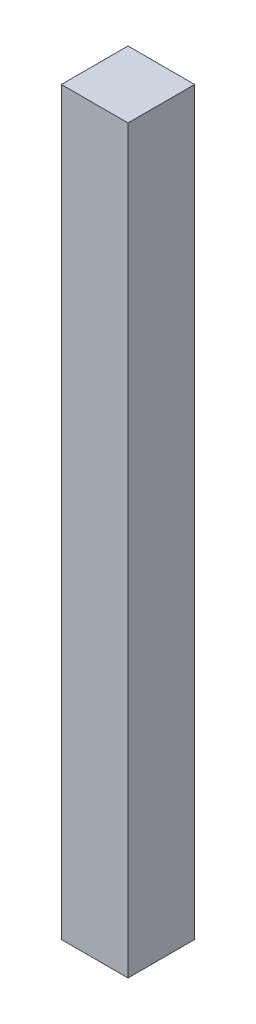
ISO-10303-21;
HEADER;
FILE_DESCRIPTION(('STEP AP214'),'2;1');
FILE_NAME('part.step','',(''),(''),'','','');
FILE_SCHEMA(('AUTOMOTIVE_DESIGN { 1 0 10303 214 1 1 1 1 }'));
ENDSEC;
DATA;
#1=APPLICATION_CONTEXT('core data for automotive mechanical design processes');
#2=APPLICATION_PROTOCOL_DEFINITION('international standard','automotive_design',2000,#1);
#3=PRODUCT_CONTEXT('',#1,'mechanical');
#4=PRODUCT('Part','Part','',(#3));
#5=PRODUCT_RELATED_PRODUCT_CATEGORY('part','',(#4));
#6=PRODUCT_DEFINITION_FORMATION('','',#4);
#7=PRODUCT_DEFINITION_CONTEXT('part definition',#1,'design');
#8=PRODUCT_DEFINITION('design','',#6,#7);
#9=PRODUCT_DEFINITION_SHAPE('','',#8);
#10=(LENGTH_UNIT() NAMED_UNIT(*) SI_UNIT(.MILLI.,.METRE.));
#11=(NAMED_UNIT(*) PLANE_ANGLE_UNIT() SI_UNIT($,.RADIAN.));
#12=(NAMED_UNIT(*) SI_UNIT($,.STERADIAN.) SOLID_ANGLE_UNIT());
#13=UNCERTAINTY_MEASURE_WITH_UNIT(LENGTH_MEASURE(1.E-05),#10,'distance_accuracy_value','');
#14=(GEOMETRIC_REPRESENTATION_CONTEXT(3) GLOBAL_UNCERTAINTY_ASSIGNED_CONTEXT((#13)) GLOBAL_UNIT_ASSIGNED_CONTEXT((#10,
#11,#12)) REPRESENTATION_CONTEXT('',''));
#15=CARTESIAN_POINT('',(0.,0.,0.));
#16=DIRECTION('',(0.,0.,1.));
#17=DIRECTION('',(1.,0.,0.));
#18=AXIS2_PLACEMENT_3D('',#15,#16,#17);
#19=CARTESIAN_POINT('',(654.,436.,-30.));
#20=DIRECTION('',(-1.,0.,0.));
#21=DIRECTION('',(0.,0.,1.));
#22=AXIS2_PLACEMENT_3D('',#19,#20,#21);
#23=PLANE('',#22);
#24=DIRECTION('',(0.,-1.,0.));
#25=VECTOR('',#24,1.);
#26=CARTESIAN_POINT('',(654.,436.,-12.));
#27=LINE('',#26,#25);
#28=CARTESIAN_POINT('',(654.,636.,-12.));
#29=VERTEX_POINT('',#28);
#30=CARTESIAN_POINT('',(654.,436.,-12.));
#31=VERTEX_POINT('',#30);
#32=EDGE_CURVE('E103',#29,#31,#27,.T.);
#33=ORIENTED_EDGE('',*,*,#32,.F.);
#34=DIRECTION('',(0.,0.,1.));
#35=VECTOR('',#34,1.);
#36=CARTESIAN_POINT('',(654.,636.,-30.));
#37=LINE('',#36,#35);
#38=CARTESIAN_POINT('',(654.,636.,-30.));
#39=VERTEX_POINT('',#38);
#40=EDGE_CURVE('E11',#39,#29,#37,.T.);
#41=ORIENTED_EDGE('',*,*,#40,.F.);
#42=DIRECTION('',(0.,-1.,0.));
#43=VECTOR('',#42,1.);
#44=CARTESIAN_POINT('',(654.,436.,-30.));
#45=LINE('',#44,#43);
#46=CARTESIAN_POINT('',(654.,436.,-30.));
#47=VERTEX_POINT('',#46);
#48=EDGE_CURVE('E97',#39,#47,#45,.T.);
#49=ORIENTED_EDGE('',*,*,#48,.T.);
#50=DIRECTION('',(0.,0.,1.));
#51=VECTOR('',#50,1.);
#52=CARTESIAN_POINT('',(654.,436.,-30.));
#53=LINE('',#52,#51);
#54=EDGE_CURVE('E42',#47,#31,#53,.T.);
#55=ORIENTED_EDGE('',*,*,#54,.T.);
#56=EDGE_LOOP('',(#33,#41,#49,#55));
#57=FACE_BOUND('',#56,.T.);
#58=ADVANCED_FACE('F39',(#57),#23,.T.);
#59=CARTESIAN_POINT('',(654.,636.,-30.));
#60=DIRECTION('',(0.,1.,0.));
#61=DIRECTION('',(0.,0.,1.));
#62=AXIS2_PLACEMENT_3D('',#59,#60,#61);
#63=PLANE('',#62);
#64=DIRECTION('',(-1.,0.,0.));
#65=VECTOR('',#64,1.);
#66=CARTESIAN_POINT('',(654.,636.,-12.));
#67=LINE('',#66,#65);
#68=CARTESIAN_POINT('',(672.,636.,-12.));
#69=VERTEX_POINT('',#68);
#70=EDGE_CURVE('E99',#69,#29,#67,.T.);
#71=ORIENTED_EDGE('',*,*,#70,.F.);
#72=DIRECTION('',(0.,0.,1.));
#73=VECTOR('',#72,1.);
#74=CARTESIAN_POINT('',(672.,636.,-30.));
#75=LINE('',#74,#73);
#76=CARTESIAN_POINT('',(672.,636.,-30.));
#77=VERTEX_POINT('',#76);
#78=EDGE_CURVE('E48',#77,#69,#75,.T.);
#79=ORIENTED_EDGE('',*,*,#78,.F.);
#80=DIRECTION('',(-1.,0.,0.));
#81=VECTOR('',#80,1.);
#82=CARTESIAN_POINT('',(654.,636.,-30.));
#83=LINE('',#82,#81);
#84=EDGE_CURVE('E94',#77,#39,#83,.T.);
#85=ORIENTED_EDGE('',*,*,#84,.T.);
#86=ORIENTED_EDGE('',*,*,#40,.T.);
#87=EDGE_LOOP('',(#71,#79,#85,#86));
#88=FACE_BOUND('',#87,.T.);
#89=ADVANCED_FACE('F113',(#88),#63,.T.);
#90=CARTESIAN_POINT('',(672.,436.,-30.));
#91=DIRECTION('',(1.,0.,0.));
#92=DIRECTION('',(0.,0.,-1.));
#93=AXIS2_PLACEMENT_3D('',#90,#91,#92);
#94=PLANE('',#93);
#95=DIRECTION('',(0.,1.,0.));
#96=VECTOR('',#95,1.);
#97=CARTESIAN_POINT('',(672.,436.,-12.));
#98=LINE('',#97,#96);
#99=CARTESIAN_POINT('',(672.,436.,-12.));
#100=VERTEX_POINT('',#99);
#101=EDGE_CURVE('E89',#100,#69,#98,.T.);
#102=ORIENTED_EDGE('',*,*,#101,.F.);
#103=DIRECTION('',(0.,0.,1.));
#104=VECTOR('',#103,1.);
#105=CARTESIAN_POINT('',(672.,436.,-30.));
#106=LINE('',#105,#104);
#107=CARTESIAN_POINT('',(672.,436.,-30.));
#108=VERTEX_POINT('',#107);
#109=EDGE_CURVE('E84',#108,#100,#106,.T.);
#110=ORIENTED_EDGE('',*,*,#109,.F.);
#111=DIRECTION('',(0.,1.,0.));
#112=VECTOR('',#111,1.);
#113=CARTESIAN_POINT('',(672.,436.,-30.));
#114=LINE('',#113,#112);
#115=EDGE_CURVE('E87',#108,#77,#114,.T.);
#116=ORIENTED_EDGE('',*,*,#115,.T.);
#117=ORIENTED_EDGE('',*,*,#78,.T.);
#118=EDGE_LOOP('',(#102,#110,#116,#117));
#119=FACE_BOUND('',#118,.T.);
#120=ADVANCED_FACE('F86',(#119),#94,.T.);
#121=CARTESIAN_POINT('',(654.,436.,-30.));
#122=DIRECTION('',(0.,-1.,0.));
#123=DIRECTION('',(0.,0.,-1.));
#124=AXIS2_PLACEMENT_3D('',#121,#122,#123);
#125=PLANE('',#124);
#126=DIRECTION('',(1.,0.,0.));
#127=VECTOR('',#126,1.);
#128=CARTESIAN_POINT('',(654.,436.,-12.));
#129=LINE('',#128,#127);
#130=EDGE_CURVE('E106',#31,#100,#129,.T.);
#131=ORIENTED_EDGE('',*,*,#130,.F.);
#132=ORIENTED_EDGE('',*,*,#54,.F.);
#133=DIRECTION('',(1.,0.,0.));
#134=VECTOR('',#133,1.);
#135=CARTESIAN_POINT('',(654.,436.,-30.));
#136=LINE('',#135,#134);
#137=EDGE_CURVE('E93',#47,#108,#136,.T.);
#138=ORIENTED_EDGE('',*,*,#137,.T.);
#139=ORIENTED_EDGE('',*,*,#109,.T.);
#140=EDGE_LOOP('',(#131,#132,#138,#139));
#141=FACE_BOUND('',#140,.T.);
#142=ADVANCED_FACE('F96',(#141),#125,.T.);
#143=CARTESIAN_POINT('',(0.,0.,-30.));
#144=DIRECTION('',(0.,0.,-1.));
#145=DIRECTION('',(-1.,0.,0.));
#146=AXIS2_PLACEMENT_3D('',#143,#144,#145);
#147=PLANE('',#146);
#148=ORIENTED_EDGE('',*,*,#48,.F.);
#149=ORIENTED_EDGE('',*,*,#84,.F.);
#150=ORIENTED_EDGE('',*,*,#115,.F.);
#151=ORIENTED_EDGE('',*,*,#137,.F.);
#152=EDGE_LOOP('',(#148,#149,#150,#151));
#153=FACE_BOUND('',#152,.T.);
#154=ADVANCED_FACE('F92',(#153),#147,.T.);
#155=CARTESIAN_POINT('',(0.,0.,-12.));
#156=DIRECTION('',(0.,0.,-1.));
#157=DIRECTION('',(-1.,0.,0.));
#158=AXIS2_PLACEMENT_3D('',#155,#156,#157);
#159=PLANE('',#158);
#160=ORIENTED_EDGE('',*,*,#32,.T.);
#161=ORIENTED_EDGE('',*,*,#130,.T.);
#162=ORIENTED_EDGE('',*,*,#101,.T.);
#163=ORIENTED_EDGE('',*,*,#70,.T.);
#164=EDGE_LOOP('',(#160,#161,#162,#163));
#165=FACE_BOUND('',#164,.T.);
#166=ADVANCED_FACE('F112',(#165),#159,.F.);
#167=CLOSED_SHELL('',(#58,#89,#120,#142,#154,#166));
#168=MANIFOLD_SOLID_BREP('B2',#167);
#169=ADVANCED_BREP_SHAPE_REPRESENTATION('',(#18,#168),#14);
#170=SHAPE_DEFINITION_REPRESENTATION(#9,#169);
ENDSEC;
END-ISO-10303-21;
